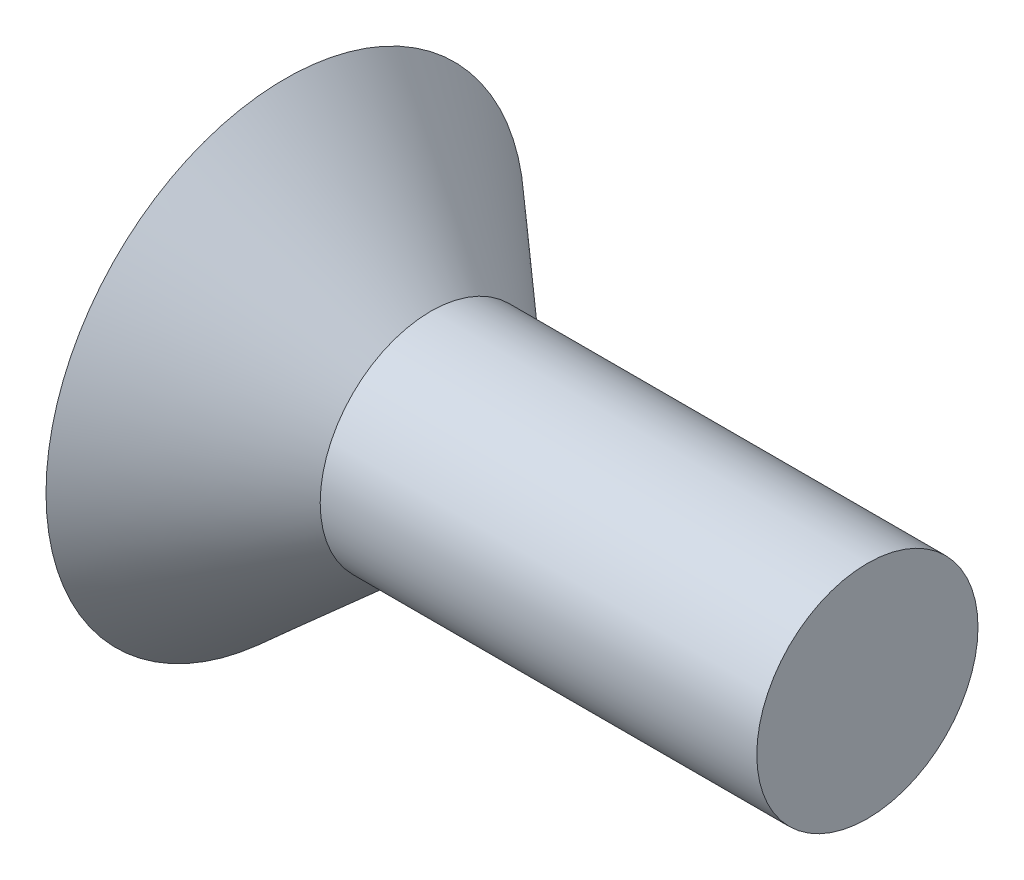
ISO-10303-21;
HEADER;
FILE_DESCRIPTION(('STEP AP214'),'2;1');
FILE_NAME('part.step','',(''),(''),'','','');
FILE_SCHEMA(('AUTOMOTIVE_DESIGN { 1 0 10303 214 1 1 1 1 }'));
ENDSEC;
DATA;
#1=APPLICATION_CONTEXT('core data for automotive mechanical design processes');
#2=APPLICATION_PROTOCOL_DEFINITION('international standard','automotive_design',2000,#1);
#3=PRODUCT_CONTEXT('',#1,'mechanical');
#4=PRODUCT('Part','Part','',(#3));
#5=PRODUCT_RELATED_PRODUCT_CATEGORY('part','',(#4));
#6=PRODUCT_DEFINITION_FORMATION('','',#4);
#7=PRODUCT_DEFINITION_CONTEXT('part definition',#1,'design');
#8=PRODUCT_DEFINITION('design','',#6,#7);
#9=PRODUCT_DEFINITION_SHAPE('','',#8);
#10=(LENGTH_UNIT() NAMED_UNIT(*) SI_UNIT(.MILLI.,.METRE.));
#11=(NAMED_UNIT(*) PLANE_ANGLE_UNIT() SI_UNIT($,.RADIAN.));
#12=(NAMED_UNIT(*) SI_UNIT($,.STERADIAN.) SOLID_ANGLE_UNIT());
#13=UNCERTAINTY_MEASURE_WITH_UNIT(LENGTH_MEASURE(1.E-05),#10,'distance_accuracy_value','');
#14=(GEOMETRIC_REPRESENTATION_CONTEXT(3) GLOBAL_UNCERTAINTY_ASSIGNED_CONTEXT((#13)) GLOBAL_UNIT_ASSIGNED_CONTEXT((#10,
#11,#12)) REPRESENTATION_CONTEXT('',''));
#15=CARTESIAN_POINT('',(0.,0.,0.));
#16=DIRECTION('',(0.,0.,1.));
#17=DIRECTION('',(1.,0.,0.));
#18=AXIS2_PLACEMENT_3D('',#15,#16,#17);
#19=CARTESIAN_POINT('',(0.,0.,0.));
#20=DIRECTION('',(-1.,0.,0.));
#21=DIRECTION('',(0.,0.,1.));
#22=AXIS2_PLACEMENT_3D('',#19,#20,#21);
#23=PLANE('',#22);
#24=CARTESIAN_POINT('',(0.,0.,0.));
#25=DIRECTION('',(-1.,0.,0.));
#26=DIRECTION('',(0.,0.,1.));
#27=AXIS2_PLACEMENT_3D('',#24,#25,#26);
#28=CIRCLE('',#27,2.413);
#29=CARTESIAN_POINT('',(0.,0.,2.413));
#30=VERTEX_POINT('',#29);
#31=EDGE_CURVE('E155',#30,#30,#28,.T.);
#32=ORIENTED_EDGE('',*,*,#31,.F.);
#33=EDGE_LOOP('',(#32));
#34=FACE_BOUND('',#33,.T.);
#35=ADVANCED_FACE('F35',(#34),#23,.F.);
#36=CARTESIAN_POINT('',(-12.7,0.,0.));
#37=DIRECTION('',(-1.,0.,0.));
#38=DIRECTION('',(0.,0.,1.));
#39=AXIS2_PLACEMENT_3D('',#36,#37,#38);
#40=CYLINDRICAL_SURFACE('',#39,2.413);
#41=CARTESIAN_POINT('',(-9.525,0.,0.));
#42=DIRECTION('',(-1.,0.,0.));
#43=DIRECTION('',(0.,0.,1.));
#44=AXIS2_PLACEMENT_3D('',#41,#42,#43);
#45=CIRCLE('',#44,2.413);
#46=CARTESIAN_POINT('',(-9.525,0.,2.413));
#47=VERTEX_POINT('',#46);
#48=EDGE_CURVE('E152',#47,#47,#45,.T.);
#49=ORIENTED_EDGE('',*,*,#48,.F.);
#50=EDGE_LOOP('',(#49));
#51=FACE_BOUND('',#50,.T.);
#52=ORIENTED_EDGE('',*,*,#31,.T.);
#53=EDGE_LOOP('',(#52));
#54=FACE_BOUND('',#53,.T.);
#55=ADVANCED_FACE('F224',(#51,#54),#40,.T.);
#56=CARTESIAN_POINT('',(-9.525,0.,0.));
#57=DIRECTION('',(-1.,0.,0.));
#58=DIRECTION('',(0.,0.,1.));
#59=AXIS2_PLACEMENT_3D('',#56,#57,#58);
#60=CONICAL_SURFACE('',#59,2.413,0.723904667083208);
#61=CARTESIAN_POINT('',(-12.7,0.,0.));
#62=DIRECTION('',(-1.,0.,0.));
#63=DIRECTION('',(0.,0.,1.));
#64=AXIS2_PLACEMENT_3D('',#61,#62,#63);
#65=CIRCLE('',#64,5.2197);
#66=CARTESIAN_POINT('',(-12.7,0.,5.2197));
#67=VERTEX_POINT('',#66);
#68=EDGE_CURVE('E140',#67,#67,#65,.T.);
#69=ORIENTED_EDGE('',*,*,#68,.F.);
#70=EDGE_LOOP('',(#69));
#71=FACE_BOUND('',#70,.T.);
#72=ORIENTED_EDGE('',*,*,#48,.T.);
#73=EDGE_LOOP('',(#72));
#74=FACE_BOUND('',#73,.T.);
#75=ADVANCED_FACE('F230',(#71,#74),#60,.T.);
#76=CARTESIAN_POINT('',(-12.7,5.2197,0.));
#77=DIRECTION('',(1.,0.,0.));
#78=DIRECTION('',(0.,0.,-1.));
#79=AXIS2_PLACEMENT_3D('',#76,#77,#78);
#80=PLANE('',#79);
#81=DIRECTION('',(0.,1.,0.));
#82=VECTOR('',#81,1.);
#83=CARTESIAN_POINT('',(-12.7,5.2197,1.6383));
#84=LINE('',#83,#82);
#85=CARTESIAN_POINT('',(-12.7,0.945872946013366,1.6383));
#86=VERTEX_POINT('',#85);
#87=CARTESIAN_POINT('',(-12.7,-0.945872946013365,1.6383));
#88=VERTEX_POINT('',#87);
#89=EDGE_CURVE('E161',#86,#88,#84,.F.);
#90=ORIENTED_EDGE('',*,*,#89,.T.);
#91=DIRECTION('',(0.,0.5,0.866025403784439));
#92=VECTOR('',#91,1.);
#93=CARTESIAN_POINT('',(-12.7,-0.113884419020047,3.07934640006682));
#94=LINE('',#93,#92);
#95=CARTESIAN_POINT('',(-12.7,-1.89174589202673,0.));
#96=VERTEX_POINT('',#95);
#97=EDGE_CURVE('E171',#88,#96,#94,.F.);
#98=ORIENTED_EDGE('',*,*,#97,.T.);
#99=DIRECTION('',(0.,-0.5,0.866025403784439));
#100=VECTOR('',#99,1.);
#101=CARTESIAN_POINT('',(-12.7,-0.113884419020049,-3.07934640006682));
#102=LINE('',#101,#100);
#103=CARTESIAN_POINT('',(-12.7,-0.945872946013364,-1.6383));
#104=VERTEX_POINT('',#103);
#105=EDGE_CURVE('E169',#96,#104,#102,.F.);
#106=ORIENTED_EDGE('',*,*,#105,.T.);
#107=DIRECTION('',(0.,-1.,0.));
#108=VECTOR('',#107,1.);
#109=CARTESIAN_POINT('',(-12.7,5.2197,-1.6383));
#110=LINE('',#109,#108);
#111=CARTESIAN_POINT('',(-12.7,0.945872946013364,-1.6383));
#112=VERTEX_POINT('',#111);
#113=EDGE_CURVE('E167',#104,#112,#110,.F.);
#114=ORIENTED_EDGE('',*,*,#113,.T.);
#115=DIRECTION('',(0.,-0.5,-0.866025403784439));
#116=VECTOR('',#115,1.);
#117=CARTESIAN_POINT('',(-12.7,2.72373441902005,1.44104640006682));
#118=LINE('',#117,#116);
#119=CARTESIAN_POINT('',(-12.7,1.89174589202673,0.));
#120=VERTEX_POINT('',#119);
#121=EDGE_CURVE('E165',#112,#120,#118,.F.);
#122=ORIENTED_EDGE('',*,*,#121,.T.);
#123=DIRECTION('',(0.,0.5,-0.866025403784439));
#124=VECTOR('',#123,1.);
#125=CARTESIAN_POINT('',(-12.7,2.72373441902004,-1.44104640006682));
#126=LINE('',#125,#124);
#127=EDGE_CURVE('E163',#120,#86,#126,.F.);
#128=ORIENTED_EDGE('',*,*,#127,.T.);
#129=EDGE_LOOP('',(#90,#98,#106,#114,#122,#128));
#130=FACE_BOUND('',#129,.T.);
#131=ORIENTED_EDGE('',*,*,#68,.T.);
#132=EDGE_LOOP('',(#131));
#133=FACE_BOUND('',#132,.T.);
#134=ADVANCED_FACE('F220',(#130,#133),#80,.F.);
#135=CARTESIAN_POINT('',(-10.16,0.916543552338533,1.5875));
#136=DIRECTION('',(0.,0.866025403784439,0.5));
#137=DIRECTION('',(0.,-0.5,0.866025403784439));
#138=AXIS2_PLACEMENT_3D('',#135,#136,#137);
#139=PLANE('',#138);
#140=DIRECTION('',(-1.,0.,0.));
#141=VECTOR('',#140,1.);
#142=CARTESIAN_POINT('',(-10.16,0.916543552338533,1.5875));
#143=LINE('',#142,#141);
#144=CARTESIAN_POINT('',(-10.16,0.916543552338533,1.5875));
#145=VERTEX_POINT('',#144);
#146=CARTESIAN_POINT('',(-12.6492,0.916543552338533,1.5875));
#147=VERTEX_POINT('',#146);
#148=EDGE_CURVE('E138',#145,#147,#143,.T.);
#149=ORIENTED_EDGE('',*,*,#148,.T.);
#150=DIRECTION('',(0.,0.5,-0.866025403784439));
#151=VECTOR('',#150,1.);
#152=CARTESIAN_POINT('',(-12.6492,0.916543552338533,1.5875));
#153=LINE('',#152,#151);
#154=CARTESIAN_POINT('',(-12.6492,1.83308710467706,0.));
#155=VERTEX_POINT('',#154);
#156=EDGE_CURVE('E44',#147,#155,#153,.T.);
#157=ORIENTED_EDGE('',*,*,#156,.T.);
#158=DIRECTION('',(-1.,0.,0.));
#159=VECTOR('',#158,1.);
#160=CARTESIAN_POINT('',(-10.16,1.83308710467706,0.));
#161=LINE('',#160,#159);
#162=CARTESIAN_POINT('',(-10.16,1.83308710467706,0.));
#163=VERTEX_POINT('',#162);
#164=EDGE_CURVE('E104',#163,#155,#161,.T.);
#165=ORIENTED_EDGE('',*,*,#164,.F.);
#166=DIRECTION('',(0.,0.5,-0.866025403784439));
#167=VECTOR('',#166,1.);
#168=CARTESIAN_POINT('',(-10.16,0.916543552338533,1.5875));
#169=LINE('',#168,#167);
#170=EDGE_CURVE('E108',#145,#163,#169,.T.);
#171=ORIENTED_EDGE('',*,*,#170,.F.);
#172=EDGE_LOOP('',(#149,#157,#165,#171));
#173=FACE_BOUND('',#172,.T.);
#174=ADVANCED_FACE('F106',(#173),#139,.F.);
#175=CARTESIAN_POINT('',(-10.16,-0.916543552338532,1.5875));
#176=DIRECTION('',(0.,0.,1.));
#177=DIRECTION('',(0.,-1.,0.));
#178=AXIS2_PLACEMENT_3D('',#175,#176,#177);
#179=PLANE('',#178);
#180=DIRECTION('',(-1.,0.,0.));
#181=VECTOR('',#180,1.);
#182=CARTESIAN_POINT('',(-10.16,-0.916543552338532,1.5875));
#183=LINE('',#182,#181);
#184=CARTESIAN_POINT('',(-10.16,-0.916543552338532,1.5875));
#185=VERTEX_POINT('',#184);
#186=CARTESIAN_POINT('',(-12.6492,-0.916543552338532,1.5875));
#187=VERTEX_POINT('',#186);
#188=EDGE_CURVE('E141',#185,#187,#183,.T.);
#189=ORIENTED_EDGE('',*,*,#188,.T.);
#190=DIRECTION('',(0.,1.,0.));
#191=VECTOR('',#190,1.);
#192=CARTESIAN_POINT('',(-12.6492,-0.916543552338532,1.5875));
#193=LINE('',#192,#191);
#194=EDGE_CURVE('E11',#187,#147,#193,.T.);
#195=ORIENTED_EDGE('',*,*,#194,.T.);
#196=ORIENTED_EDGE('',*,*,#148,.F.);
#197=DIRECTION('',(0.,1.,0.));
#198=VECTOR('',#197,1.);
#199=CARTESIAN_POINT('',(-10.16,-0.916543552338532,1.5875));
#200=LINE('',#199,#198);
#201=EDGE_CURVE('E113',#185,#145,#200,.T.);
#202=ORIENTED_EDGE('',*,*,#201,.F.);
#203=EDGE_LOOP('',(#189,#195,#196,#202));
#204=FACE_BOUND('',#203,.T.);
#205=ADVANCED_FACE('F212',(#204),#179,.F.);
#206=CARTESIAN_POINT('',(-10.16,-1.83308710467706,0.));
#207=DIRECTION('',(0.,-0.866025403784439,0.5));
#208=DIRECTION('',(0.,-0.5,-0.866025403784439));
#209=AXIS2_PLACEMENT_3D('',#206,#207,#208);
#210=PLANE('',#209);
#211=DIRECTION('',(-1.,0.,0.));
#212=VECTOR('',#211,1.);
#213=CARTESIAN_POINT('',(-10.16,-1.83308710467706,0.));
#214=LINE('',#213,#212);
#215=CARTESIAN_POINT('',(-10.16,-1.83308710467706,0.));
#216=VERTEX_POINT('',#215);
#217=CARTESIAN_POINT('',(-12.6492,-1.83308710467706,0.));
#218=VERTEX_POINT('',#217);
#219=EDGE_CURVE('E143',#216,#218,#214,.T.);
#220=ORIENTED_EDGE('',*,*,#219,.T.);
#221=DIRECTION('',(0.,0.5,0.866025403784439));
#222=VECTOR('',#221,1.);
#223=CARTESIAN_POINT('',(-12.6492,-1.83308710467706,0.));
#224=LINE('',#223,#222);
#225=EDGE_CURVE('E158',#218,#187,#224,.T.);
#226=ORIENTED_EDGE('',*,*,#225,.T.);
#227=ORIENTED_EDGE('',*,*,#188,.F.);
#228=DIRECTION('',(0.,0.5,0.866025403784439));
#229=VECTOR('',#228,1.);
#230=CARTESIAN_POINT('',(-10.16,-1.83308710467706,0.));
#231=LINE('',#230,#229);
#232=EDGE_CURVE('E135',#216,#185,#231,.T.);
#233=ORIENTED_EDGE('',*,*,#232,.F.);
#234=EDGE_LOOP('',(#220,#226,#227,#233));
#235=FACE_BOUND('',#234,.T.);
#236=ADVANCED_FACE('F210',(#235),#210,.F.);
#237=CARTESIAN_POINT('',(-10.16,-0.916543552338531,-1.5875));
#238=DIRECTION('',(0.,-0.866025403784439,-0.5));
#239=DIRECTION('',(0.,0.5,-0.866025403784439));
#240=AXIS2_PLACEMENT_3D('',#237,#238,#239);
#241=PLANE('',#240);
#242=DIRECTION('',(-1.,0.,0.));
#243=VECTOR('',#242,1.);
#244=CARTESIAN_POINT('',(-10.16,-0.916543552338531,-1.5875));
#245=LINE('',#244,#243);
#246=CARTESIAN_POINT('',(-10.16,-0.916543552338531,-1.5875));
#247=VERTEX_POINT('',#246);
#248=CARTESIAN_POINT('',(-12.6492,-0.916543552338531,-1.5875));
#249=VERTEX_POINT('',#248);
#250=EDGE_CURVE('E146',#247,#249,#245,.T.);
#251=ORIENTED_EDGE('',*,*,#250,.T.);
#252=DIRECTION('',(0.,-0.5,0.866025403784439));
#253=VECTOR('',#252,1.);
#254=CARTESIAN_POINT('',(-12.6492,-0.916543552338531,-1.5875));
#255=LINE('',#254,#253);
#256=EDGE_CURVE('E174',#249,#218,#255,.T.);
#257=ORIENTED_EDGE('',*,*,#256,.T.);
#258=ORIENTED_EDGE('',*,*,#219,.F.);
#259=DIRECTION('',(0.,-0.5,0.866025403784439));
#260=VECTOR('',#259,1.);
#261=CARTESIAN_POINT('',(-10.16,-0.916543552338531,-1.5875));
#262=LINE('',#261,#260);
#263=EDGE_CURVE('E132',#247,#216,#262,.T.);
#264=ORIENTED_EDGE('',*,*,#263,.F.);
#265=EDGE_LOOP('',(#251,#257,#258,#264));
#266=FACE_BOUND('',#265,.T.);
#267=ADVANCED_FACE('F205',(#266),#241,.F.);
#268=CARTESIAN_POINT('',(-10.16,0.916543552338531,-1.5875));
#269=DIRECTION('',(0.,0.,-1.));
#270=DIRECTION('',(0.,1.,0.));
#271=AXIS2_PLACEMENT_3D('',#268,#269,#270);
#272=PLANE('',#271);
#273=DIRECTION('',(-1.,0.,0.));
#274=VECTOR('',#273,1.);
#275=CARTESIAN_POINT('',(-10.16,0.916543552338531,-1.5875));
#276=LINE('',#275,#274);
#277=CARTESIAN_POINT('',(-10.16,0.916543552338531,-1.5875));
#278=VERTEX_POINT('',#277);
#279=CARTESIAN_POINT('',(-12.6492,0.916543552338531,-1.5875));
#280=VERTEX_POINT('',#279);
#281=EDGE_CURVE('E112',#278,#280,#276,.T.);
#282=ORIENTED_EDGE('',*,*,#281,.T.);
#283=DIRECTION('',(0.,-1.,0.));
#284=VECTOR('',#283,1.);
#285=CARTESIAN_POINT('',(-12.6492,0.916543552338531,-1.5875));
#286=LINE('',#285,#284);
#287=EDGE_CURVE('E176',#280,#249,#286,.T.);
#288=ORIENTED_EDGE('',*,*,#287,.T.);
#289=ORIENTED_EDGE('',*,*,#250,.F.);
#290=DIRECTION('',(0.,-1.,0.));
#291=VECTOR('',#290,1.);
#292=CARTESIAN_POINT('',(-10.16,0.916543552338531,-1.5875));
#293=LINE('',#292,#291);
#294=EDGE_CURVE('E122',#278,#247,#293,.T.);
#295=ORIENTED_EDGE('',*,*,#294,.F.);
#296=EDGE_LOOP('',(#282,#288,#289,#295));
#297=FACE_BOUND('',#296,.T.);
#298=ADVANCED_FACE('F201',(#297),#272,.F.);
#299=CARTESIAN_POINT('',(-10.16,1.83308710467706,0.));
#300=DIRECTION('',(0.,0.866025403784438,-0.5));
#301=DIRECTION('',(0.,0.5,0.866025403784439));
#302=AXIS2_PLACEMENT_3D('',#299,#300,#301);
#303=PLANE('',#302);
#304=ORIENTED_EDGE('',*,*,#164,.T.);
#305=DIRECTION('',(0.,-0.5,-0.866025403784439));
#306=VECTOR('',#305,1.);
#307=CARTESIAN_POINT('',(-12.6492,1.83308710467706,0.));
#308=LINE('',#307,#306);
#309=EDGE_CURVE('E178',#155,#280,#308,.T.);
#310=ORIENTED_EDGE('',*,*,#309,.T.);
#311=ORIENTED_EDGE('',*,*,#281,.F.);
#312=DIRECTION('',(0.,-0.5,-0.866025403784438));
#313=VECTOR('',#312,1.);
#314=CARTESIAN_POINT('',(-10.16,1.83308710467706,0.));
#315=LINE('',#314,#313);
#316=EDGE_CURVE('E116',#163,#278,#315,.T.);
#317=ORIENTED_EDGE('',*,*,#316,.F.);
#318=EDGE_LOOP('',(#304,#310,#311,#317));
#319=FACE_BOUND('',#318,.T.);
#320=ADVANCED_FACE('F117',(#319),#303,.F.);
#321=CARTESIAN_POINT('',(-10.16,2.74963065701559,-1.5875));
#322=DIRECTION('',(-1.,0.,0.));
#323=DIRECTION('',(0.,0.,1.));
#324=AXIS2_PLACEMENT_3D('',#321,#322,#323);
#325=PLANE('',#324);
#326=ORIENTED_EDGE('',*,*,#170,.T.);
#327=ORIENTED_EDGE('',*,*,#316,.T.);
#328=ORIENTED_EDGE('',*,*,#294,.T.);
#329=ORIENTED_EDGE('',*,*,#263,.T.);
#330=ORIENTED_EDGE('',*,*,#232,.T.);
#331=ORIENTED_EDGE('',*,*,#201,.T.);
#332=EDGE_LOOP('',(#326,#327,#328,#329,#330,#331));
#333=FACE_BOUND('',#332,.T.);
#334=ADVANCED_FACE('F124',(#333),#325,.T.);
#335=CARTESIAN_POINT('',(-12.6492,1.87708119518931,-0.0254000000000007));
#336=DIRECTION('',(0.,-0.5,-0.866025403784439));
#337=DIRECTION('',(0.,0.866025403784438,-0.5));
#338=AXIS2_PLACEMENT_3D('',#335,#336,#337);
#339=CYLINDRICAL_SURFACE('',#338,0.0508);
#340=CARTESIAN_POINT('',(-12.6492,1.89174589202673,0.));
#341=DIRECTION('',(0.,0.,-1.));
#342=DIRECTION('',(0.,-1.,0.));
#343=AXIS2_PLACEMENT_3D('',#340,#341,#342);
#344=ELLIPSE('',#343,0.058658787349666,0.0508);
#345=EDGE_CURVE('E129',#120,#155,#344,.F.);
#346=ORIENTED_EDGE('',*,*,#345,.F.);
#347=ORIENTED_EDGE('',*,*,#121,.F.);
#348=CARTESIAN_POINT('',(-12.6492,0.945872946013364,-1.6383));
#349=DIRECTION('',(0.,-0.866025403784439,-0.5));
#350=DIRECTION('',(0.,-0.5,0.866025403784439));
#351=AXIS2_PLACEMENT_3D('',#348,#349,#350);
#352=ELLIPSE('',#351,0.058658787349666,0.0508);
#353=EDGE_CURVE('E39',#280,#112,#352,.T.);
#354=ORIENTED_EDGE('',*,*,#353,.F.);
#355=ORIENTED_EDGE('',*,*,#309,.F.);
#356=EDGE_LOOP('',(#346,#347,#354,#355));
#357=FACE_BOUND('',#356,.T.);
#358=ADVANCED_FACE('F37',(#357),#339,.T.);
#359=CARTESIAN_POINT('',(-12.6492,0.916543552338531,-1.6383));
#360=DIRECTION('',(0.,-1.,0.));
#361=DIRECTION('',(0.,0.,-1.));
#362=AXIS2_PLACEMENT_3D('',#359,#360,#361);
#363=CYLINDRICAL_SURFACE('',#362,0.0508);
#364=ORIENTED_EDGE('',*,*,#353,.T.);
#365=ORIENTED_EDGE('',*,*,#113,.F.);
#366=CARTESIAN_POINT('',(-12.6492,-0.945872946013364,-1.6383));
#367=DIRECTION('',(0.,-0.866025403784439,0.5));
#368=DIRECTION('',(0.,0.5,0.866025403784439));
#369=AXIS2_PLACEMENT_3D('',#366,#367,#368);
#370=ELLIPSE('',#369,0.058658787349666,0.0508);
#371=EDGE_CURVE('E188',#249,#104,#370,.T.);
#372=ORIENTED_EDGE('',*,*,#371,.F.);
#373=ORIENTED_EDGE('',*,*,#287,.F.);
#374=EDGE_LOOP('',(#364,#365,#372,#373));
#375=FACE_BOUND('',#374,.T.);
#376=ADVANCED_FACE('F249',(#375),#363,.T.);
#377=CARTESIAN_POINT('',(-12.6492,0.960537642850782,1.6129));
#378=DIRECTION('',(0.,0.5,-0.866025403784439));
#379=DIRECTION('',(0.,0.866025403784439,0.5));
#380=AXIS2_PLACEMENT_3D('',#377,#378,#379);
#381=CYLINDRICAL_SURFACE('',#380,0.0508);
#382=ORIENTED_EDGE('',*,*,#345,.T.);
#383=ORIENTED_EDGE('',*,*,#156,.F.);
#384=CARTESIAN_POINT('',(-12.6492,0.945872946013366,1.6383));
#385=DIRECTION('',(0.,0.866025403784438,-0.5));
#386=DIRECTION('',(0.,-0.5,-0.866025403784438));
#387=AXIS2_PLACEMENT_3D('',#384,#385,#386);
#388=ELLIPSE('',#387,0.058658787349666,0.0508);
#389=EDGE_CURVE('E185',#86,#147,#388,.F.);
#390=ORIENTED_EDGE('',*,*,#389,.F.);
#391=ORIENTED_EDGE('',*,*,#127,.F.);
#392=EDGE_LOOP('',(#382,#383,#390,#391));
#393=FACE_BOUND('',#392,.T.);
#394=ADVANCED_FACE('F194',(#393),#381,.T.);
#395=CARTESIAN_POINT('',(-12.6492,-0.960537642850781,-1.6129));
#396=DIRECTION('',(0.,-0.5,0.866025403784439));
#397=DIRECTION('',(0.,-0.866025403784439,-0.5));
#398=AXIS2_PLACEMENT_3D('',#395,#396,#397);
#399=CYLINDRICAL_SURFACE('',#398,0.0508);
#400=ORIENTED_EDGE('',*,*,#371,.T.);
#401=ORIENTED_EDGE('',*,*,#105,.F.);
#402=CARTESIAN_POINT('',(-12.6492,-1.89174589202673,0.));
#403=DIRECTION('',(0.,0.,1.));
#404=DIRECTION('',(0.,1.,0.));
#405=AXIS2_PLACEMENT_3D('',#402,#403,#404);
#406=ELLIPSE('',#405,0.058658787349666,0.0508);
#407=EDGE_CURVE('E183',#218,#96,#406,.T.);
#408=ORIENTED_EDGE('',*,*,#407,.F.);
#409=ORIENTED_EDGE('',*,*,#256,.F.);
#410=EDGE_LOOP('',(#400,#401,#408,#409));
#411=FACE_BOUND('',#410,.T.);
#412=ADVANCED_FACE('F243',(#411),#399,.T.);
#413=CARTESIAN_POINT('',(-12.6492,-0.916543552338532,1.6383));
#414=DIRECTION('',(0.,1.,0.));
#415=DIRECTION('',(0.,0.,1.));
#416=AXIS2_PLACEMENT_3D('',#413,#414,#415);
#417=CYLINDRICAL_SURFACE('',#416,0.0508);
#418=ORIENTED_EDGE('',*,*,#389,.T.);
#419=ORIENTED_EDGE('',*,*,#194,.F.);
#420=CARTESIAN_POINT('',(-12.6492,-0.945872946013365,1.6383));
#421=DIRECTION('',(0.,0.866025403784439,0.5));
#422=DIRECTION('',(0.,-0.5,0.866025403784439));
#423=AXIS2_PLACEMENT_3D('',#420,#421,#422);
#424=ELLIPSE('',#423,0.058658787349666,0.0508);
#425=EDGE_CURVE('E181',#88,#187,#424,.F.);
#426=ORIENTED_EDGE('',*,*,#425,.F.);
#427=ORIENTED_EDGE('',*,*,#89,.F.);
#428=EDGE_LOOP('',(#418,#419,#426,#427));
#429=FACE_BOUND('',#428,.T.);
#430=ADVANCED_FACE('F239',(#429),#417,.T.);
#431=CARTESIAN_POINT('',(-12.6492,-1.87708119518931,0.0254000000000004));
#432=DIRECTION('',(0.,0.5,0.866025403784439));
#433=DIRECTION('',(0.,-0.866025403784439,0.5));
#434=AXIS2_PLACEMENT_3D('',#431,#432,#433);
#435=CYLINDRICAL_SURFACE('',#434,0.0508);
#436=ORIENTED_EDGE('',*,*,#407,.T.);
#437=ORIENTED_EDGE('',*,*,#97,.F.);
#438=ORIENTED_EDGE('',*,*,#425,.T.);
#439=ORIENTED_EDGE('',*,*,#225,.F.);
#440=EDGE_LOOP('',(#436,#437,#438,#439));
#441=FACE_BOUND('',#440,.T.);
#442=ADVANCED_FACE('F236',(#441),#435,.T.);
#443=CLOSED_SHELL('',(#35,#55,#75,#134,#174,#205,#236,#267,#298,#320,#334,#358,#376,#394,#412,
#430,#442));
#444=MANIFOLD_SOLID_BREP('B2',#443);
#445=ADVANCED_BREP_SHAPE_REPRESENTATION('',(#18,#444),#14);
#446=SHAPE_DEFINITION_REPRESENTATION(#9,#445);
ENDSEC;
END-ISO-10303-21;
